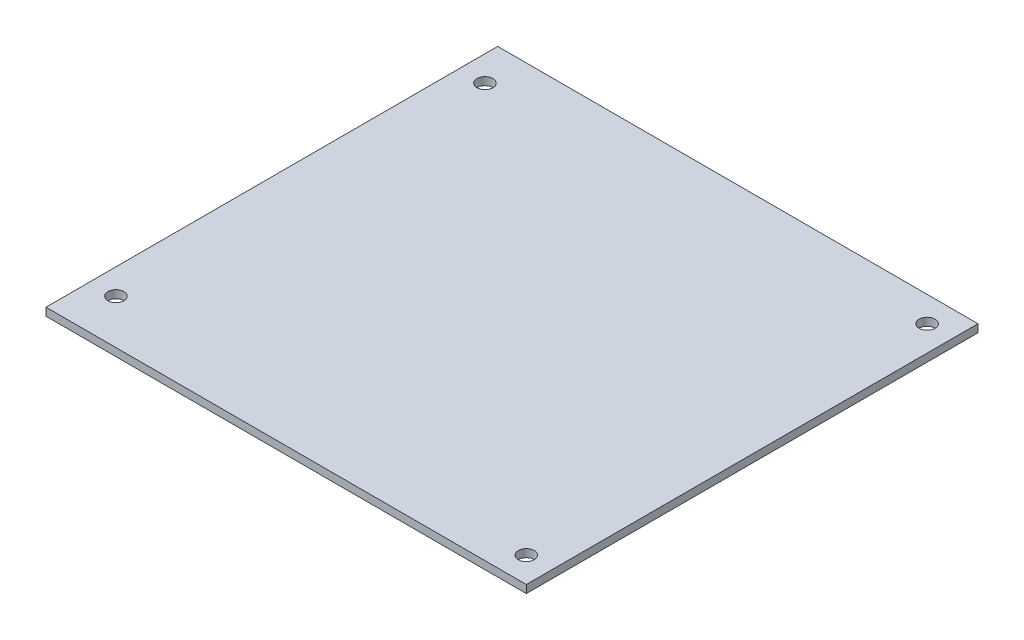
ISO-10303-21;
HEADER;
FILE_DESCRIPTION(('STEP AP214'),'2;1');
FILE_NAME('part.step','',(''),(''),'','','');
FILE_SCHEMA(('AUTOMOTIVE_DESIGN { 1 0 10303 214 1 1 1 1 }'));
ENDSEC;
DATA;
#1=APPLICATION_CONTEXT('core data for automotive mechanical design processes');
#2=APPLICATION_PROTOCOL_DEFINITION('international standard','automotive_design',2000,#1);
#3=PRODUCT_CONTEXT('',#1,'mechanical');
#4=PRODUCT('Part','Part','',(#3));
#5=PRODUCT_RELATED_PRODUCT_CATEGORY('part','',(#4));
#6=PRODUCT_DEFINITION_FORMATION('','',#4);
#7=PRODUCT_DEFINITION_CONTEXT('part definition',#1,'design');
#8=PRODUCT_DEFINITION('design','',#6,#7);
#9=PRODUCT_DEFINITION_SHAPE('','',#8);
#10=(LENGTH_UNIT() NAMED_UNIT(*) SI_UNIT(.MILLI.,.METRE.));
#11=(NAMED_UNIT(*) PLANE_ANGLE_UNIT() SI_UNIT($,.RADIAN.));
#12=(NAMED_UNIT(*) SI_UNIT($,.STERADIAN.) SOLID_ANGLE_UNIT());
#13=UNCERTAINTY_MEASURE_WITH_UNIT(LENGTH_MEASURE(1.E-05),#10,'distance_accuracy_value','');
#14=(GEOMETRIC_REPRESENTATION_CONTEXT(3) GLOBAL_UNCERTAINTY_ASSIGNED_CONTEXT((#13)) GLOBAL_UNIT_ASSIGNED_CONTEXT((#10,
#11,#12)) REPRESENTATION_CONTEXT('',''));
#15=CARTESIAN_POINT('',(0.,0.,0.));
#16=DIRECTION('',(0.,0.,1.));
#17=DIRECTION('',(1.,0.,0.));
#18=AXIS2_PLACEMENT_3D('',#15,#16,#17);
#19=CARTESIAN_POINT('',(-47.945,1.57,45.085));
#20=DIRECTION('',(1.,0.,0.));
#21=DIRECTION('',(0.,0.,-1.));
#22=AXIS2_PLACEMENT_3D('',#19,#20,#21);
#23=PLANE('',#22);
#24=DIRECTION('',(0.,0.,1.));
#25=VECTOR('',#24,1.);
#26=CARTESIAN_POINT('',(-47.945,0.,45.085));
#27=LINE('',#26,#25);
#28=CARTESIAN_POINT('',(-47.945,0.,-45.085));
#29=VERTEX_POINT('',#28);
#30=CARTESIAN_POINT('',(-47.945,0.,45.085));
#31=VERTEX_POINT('',#30);
#32=EDGE_CURVE('E95',#29,#31,#27,.T.);
#33=ORIENTED_EDGE('',*,*,#32,.T.);
#34=DIRECTION('',(0.,-1.,0.));
#35=VECTOR('',#34,1.);
#36=CARTESIAN_POINT('',(-47.945,1.57,45.085));
#37=LINE('',#36,#35);
#38=CARTESIAN_POINT('',(-47.945,1.57,45.085));
#39=VERTEX_POINT('',#38);
#40=EDGE_CURVE('E11',#39,#31,#37,.T.);
#41=ORIENTED_EDGE('',*,*,#40,.F.);
#42=DIRECTION('',(0.,0.,1.));
#43=VECTOR('',#42,1.);
#44=CARTESIAN_POINT('',(-47.945,1.57,45.085));
#45=LINE('',#44,#43);
#46=CARTESIAN_POINT('',(-47.945,1.57,-45.085));
#47=VERTEX_POINT('',#46);
#48=EDGE_CURVE('E83',#47,#39,#45,.T.);
#49=ORIENTED_EDGE('',*,*,#48,.F.);
#50=DIRECTION('',(0.,-1.,0.));
#51=VECTOR('',#50,1.);
#52=CARTESIAN_POINT('',(-47.945,1.57,-45.085));
#53=LINE('',#52,#51);
#54=EDGE_CURVE('E91',#47,#29,#53,.T.);
#55=ORIENTED_EDGE('',*,*,#54,.T.);
#56=EDGE_LOOP('',(#33,#41,#49,#55));
#57=FACE_BOUND('',#56,.T.);
#58=ADVANCED_FACE('F32',(#57),#23,.F.);
#59=CARTESIAN_POINT('',(47.945,1.57,45.085));
#60=DIRECTION('',(0.,0.,-1.));
#61=DIRECTION('',(-1.,0.,0.));
#62=AXIS2_PLACEMENT_3D('',#59,#60,#61);
#63=PLANE('',#62);
#64=DIRECTION('',(1.,0.,0.));
#65=VECTOR('',#64,1.);
#66=CARTESIAN_POINT('',(47.945,0.,45.085));
#67=LINE('',#66,#65);
#68=CARTESIAN_POINT('',(47.945,0.,45.085));
#69=VERTEX_POINT('',#68);
#70=EDGE_CURVE('E87',#31,#69,#67,.T.);
#71=ORIENTED_EDGE('',*,*,#70,.T.);
#72=DIRECTION('',(0.,-1.,0.));
#73=VECTOR('',#72,1.);
#74=CARTESIAN_POINT('',(47.945,1.57,45.085));
#75=LINE('',#74,#73);
#76=CARTESIAN_POINT('',(47.945,1.57,45.085));
#77=VERTEX_POINT('',#76);
#78=EDGE_CURVE('E40',#77,#69,#75,.T.);
#79=ORIENTED_EDGE('',*,*,#78,.F.);
#80=DIRECTION('',(1.,0.,0.));
#81=VECTOR('',#80,1.);
#82=CARTESIAN_POINT('',(47.945,1.57,45.085));
#83=LINE('',#82,#81);
#84=EDGE_CURVE('E78',#39,#77,#83,.T.);
#85=ORIENTED_EDGE('',*,*,#84,.F.);
#86=ORIENTED_EDGE('',*,*,#40,.T.);
#87=EDGE_LOOP('',(#71,#79,#85,#86));
#88=FACE_BOUND('',#87,.T.);
#89=ADVANCED_FACE('F86',(#88),#63,.F.);
#90=CARTESIAN_POINT('',(47.945,1.57,45.085));
#91=DIRECTION('',(-1.,0.,0.));
#92=DIRECTION('',(0.,0.,1.));
#93=AXIS2_PLACEMENT_3D('',#90,#91,#92);
#94=PLANE('',#93);
#95=DIRECTION('',(0.,0.,-1.));
#96=VECTOR('',#95,1.);
#97=CARTESIAN_POINT('',(47.945,0.,45.085));
#98=LINE('',#97,#96);
#99=CARTESIAN_POINT('',(47.945,0.,-45.085));
#100=VERTEX_POINT('',#99);
#101=EDGE_CURVE('E65',#69,#100,#98,.T.);
#102=ORIENTED_EDGE('',*,*,#101,.T.);
#103=DIRECTION('',(0.,-1.,0.));
#104=VECTOR('',#103,1.);
#105=CARTESIAN_POINT('',(47.945,1.57,-45.085));
#106=LINE('',#105,#104);
#107=CARTESIAN_POINT('',(47.945,1.57,-45.085));
#108=VERTEX_POINT('',#107);
#109=EDGE_CURVE('E88',#108,#100,#106,.T.);
#110=ORIENTED_EDGE('',*,*,#109,.F.);
#111=DIRECTION('',(0.,0.,-1.));
#112=VECTOR('',#111,1.);
#113=CARTESIAN_POINT('',(47.945,1.57,45.085));
#114=LINE('',#113,#112);
#115=EDGE_CURVE('E81',#77,#108,#114,.T.);
#116=ORIENTED_EDGE('',*,*,#115,.F.);
#117=ORIENTED_EDGE('',*,*,#78,.T.);
#118=EDGE_LOOP('',(#102,#110,#116,#117));
#119=FACE_BOUND('',#118,.T.);
#120=ADVANCED_FACE('F89',(#119),#94,.F.);
#121=CARTESIAN_POINT('',(47.945,1.57,-45.085));
#122=DIRECTION('',(0.,0.,1.));
#123=DIRECTION('',(1.,0.,0.));
#124=AXIS2_PLACEMENT_3D('',#121,#122,#123);
#125=PLANE('',#124);
#126=DIRECTION('',(-1.,0.,0.));
#127=VECTOR('',#126,1.);
#128=CARTESIAN_POINT('',(47.945,0.,-45.085));
#129=LINE('',#128,#127);
#130=EDGE_CURVE('E71',#100,#29,#129,.T.);
#131=ORIENTED_EDGE('',*,*,#130,.T.);
#132=ORIENTED_EDGE('',*,*,#54,.F.);
#133=DIRECTION('',(-1.,0.,0.));
#134=VECTOR('',#133,1.);
#135=CARTESIAN_POINT('',(47.945,1.57,-45.085));
#136=LINE('',#135,#134);
#137=EDGE_CURVE('E48',#108,#47,#136,.T.);
#138=ORIENTED_EDGE('',*,*,#137,.F.);
#139=ORIENTED_EDGE('',*,*,#109,.T.);
#140=EDGE_LOOP('',(#131,#132,#138,#139));
#141=FACE_BOUND('',#140,.T.);
#142=ADVANCED_FACE('F103',(#141),#125,.F.);
#143=CARTESIAN_POINT('',(0.,1.57,0.));
#144=DIRECTION('',(0.,1.,0.));
#145=DIRECTION('',(0.,0.,1.));
#146=AXIS2_PLACEMENT_3D('',#143,#144,#145);
#147=PLANE('',#146);
#148=CARTESIAN_POINT('',(42.865,1.57,-40.005));
#149=DIRECTION('',(0.,1.,0.));
#150=DIRECTION('',(0.,0.,1.));
#151=AXIS2_PLACEMENT_3D('',#148,#149,#150);
#152=CIRCLE('',#151,1.59);
#153=CARTESIAN_POINT('',(42.865,1.57,-38.415));
#154=VERTEX_POINT('',#153);
#155=EDGE_CURVE('E127',#154,#154,#152,.T.);
#156=ORIENTED_EDGE('',*,*,#155,.F.);
#157=EDGE_LOOP('',(#156));
#158=FACE_BOUND('',#157,.T.);
#159=CARTESIAN_POINT('',(-42.865,1.57,-37.465));
#160=DIRECTION('',(0.,1.,0.));
#161=DIRECTION('',(0.,0.,1.));
#162=AXIS2_PLACEMENT_3D('',#159,#160,#161);
#163=CIRCLE('',#162,1.59);
#164=CARTESIAN_POINT('',(-42.865,1.57,-35.875));
#165=VERTEX_POINT('',#164);
#166=EDGE_CURVE('E121',#165,#165,#163,.T.);
#167=ORIENTED_EDGE('',*,*,#166,.F.);
#168=EDGE_LOOP('',(#167));
#169=FACE_BOUND('',#168,.T.);
#170=CARTESIAN_POINT('',(-42.865,1.57,36.195));
#171=DIRECTION('',(0.,1.,0.));
#172=DIRECTION('',(0.,0.,1.));
#173=AXIS2_PLACEMENT_3D('',#170,#171,#172);
#174=CIRCLE('',#173,1.59);
#175=CARTESIAN_POINT('',(-42.865,1.57,37.785));
#176=VERTEX_POINT('',#175);
#177=EDGE_CURVE('E115',#176,#176,#174,.T.);
#178=ORIENTED_EDGE('',*,*,#177,.F.);
#179=EDGE_LOOP('',(#178));
#180=FACE_BOUND('',#179,.T.);
#181=CARTESIAN_POINT('',(42.865,1.57,40.005));
#182=DIRECTION('',(0.,1.,0.));
#183=DIRECTION('',(0.,0.,1.));
#184=AXIS2_PLACEMENT_3D('',#181,#182,#183);
#185=CIRCLE('',#184,1.59);
#186=CARTESIAN_POINT('',(42.865,1.57,41.595));
#187=VERTEX_POINT('',#186);
#188=EDGE_CURVE('E109',#187,#187,#185,.T.);
#189=ORIENTED_EDGE('',*,*,#188,.F.);
#190=EDGE_LOOP('',(#189));
#191=FACE_BOUND('',#190,.T.);
#192=ORIENTED_EDGE('',*,*,#48,.T.);
#193=ORIENTED_EDGE('',*,*,#84,.T.);
#194=ORIENTED_EDGE('',*,*,#115,.T.);
#195=ORIENTED_EDGE('',*,*,#137,.T.);
#196=EDGE_LOOP('',(#192,#193,#194,#195));
#197=FACE_BOUND('',#196,.T.);
#198=ADVANCED_FACE('F79',(#158,#169,#180,#191,#197),#147,.T.);
#199=CARTESIAN_POINT('',(0.,0.,0.));
#200=DIRECTION('',(0.,1.,0.));
#201=DIRECTION('',(0.,0.,1.));
#202=AXIS2_PLACEMENT_3D('',#199,#200,#201);
#203=PLANE('',#202);
#204=CARTESIAN_POINT('',(42.865,0.,-40.005));
#205=DIRECTION('',(0.,1.,0.));
#206=DIRECTION('',(0.,0.,1.));
#207=AXIS2_PLACEMENT_3D('',#204,#205,#206);
#208=CIRCLE('',#207,1.59);
#209=CARTESIAN_POINT('',(42.865,0.,-38.415));
#210=VERTEX_POINT('',#209);
#211=EDGE_CURVE('E124',#210,#210,#208,.T.);
#212=ORIENTED_EDGE('',*,*,#211,.T.);
#213=EDGE_LOOP('',(#212));
#214=FACE_BOUND('',#213,.T.);
#215=CARTESIAN_POINT('',(-42.865,0.,-37.465));
#216=DIRECTION('',(0.,1.,0.));
#217=DIRECTION('',(0.,0.,1.));
#218=AXIS2_PLACEMENT_3D('',#215,#216,#217);
#219=CIRCLE('',#218,1.59);
#220=CARTESIAN_POINT('',(-42.865,0.,-35.875));
#221=VERTEX_POINT('',#220);
#222=EDGE_CURVE('E118',#221,#221,#219,.T.);
#223=ORIENTED_EDGE('',*,*,#222,.T.);
#224=EDGE_LOOP('',(#223));
#225=FACE_BOUND('',#224,.T.);
#226=CARTESIAN_POINT('',(-42.865,0.,36.195));
#227=DIRECTION('',(0.,1.,0.));
#228=DIRECTION('',(0.,0.,1.));
#229=AXIS2_PLACEMENT_3D('',#226,#227,#228);
#230=CIRCLE('',#229,1.59);
#231=CARTESIAN_POINT('',(-42.865,0.,37.785));
#232=VERTEX_POINT('',#231);
#233=EDGE_CURVE('E112',#232,#232,#230,.T.);
#234=ORIENTED_EDGE('',*,*,#233,.T.);
#235=EDGE_LOOP('',(#234));
#236=FACE_BOUND('',#235,.T.);
#237=CARTESIAN_POINT('',(42.865,0.,40.005));
#238=DIRECTION('',(0.,1.,0.));
#239=DIRECTION('',(0.,0.,1.));
#240=AXIS2_PLACEMENT_3D('',#237,#238,#239);
#241=CIRCLE('',#240,1.59);
#242=CARTESIAN_POINT('',(42.865,0.,41.595));
#243=VERTEX_POINT('',#242);
#244=EDGE_CURVE('E98',#243,#243,#241,.T.);
#245=ORIENTED_EDGE('',*,*,#244,.T.);
#246=EDGE_LOOP('',(#245));
#247=FACE_BOUND('',#246,.T.);
#248=ORIENTED_EDGE('',*,*,#32,.F.);
#249=ORIENTED_EDGE('',*,*,#130,.F.);
#250=ORIENTED_EDGE('',*,*,#101,.F.);
#251=ORIENTED_EDGE('',*,*,#70,.F.);
#252=EDGE_LOOP('',(#248,#249,#250,#251));
#253=FACE_BOUND('',#252,.T.);
#254=ADVANCED_FACE('F106',(#214,#225,#236,#247,#253),#203,.F.);
#255=CARTESIAN_POINT('',(42.865,0.,40.005));
#256=DIRECTION('',(0.,1.,0.));
#257=DIRECTION('',(0.,0.,1.));
#258=AXIS2_PLACEMENT_3D('',#255,#256,#257);
#259=CYLINDRICAL_SURFACE('',#258,1.59);
#260=ORIENTED_EDGE('',*,*,#244,.F.);
#261=EDGE_LOOP('',(#260));
#262=FACE_BOUND('',#261,.T.);
#263=ORIENTED_EDGE('',*,*,#188,.T.);
#264=EDGE_LOOP('',(#263));
#265=FACE_BOUND('',#264,.T.);
#266=ADVANCED_FACE('F151',(#262,#265),#259,.F.);
#267=CARTESIAN_POINT('',(-42.865,0.,36.195));
#268=DIRECTION('',(0.,1.,0.));
#269=DIRECTION('',(0.,0.,1.));
#270=AXIS2_PLACEMENT_3D('',#267,#268,#269);
#271=CYLINDRICAL_SURFACE('',#270,1.59);
#272=ORIENTED_EDGE('',*,*,#233,.F.);
#273=EDGE_LOOP('',(#272));
#274=FACE_BOUND('',#273,.T.);
#275=ORIENTED_EDGE('',*,*,#177,.T.);
#276=EDGE_LOOP('',(#275));
#277=FACE_BOUND('',#276,.T.);
#278=ADVANCED_FACE('F153',(#274,#277),#271,.F.);
#279=CARTESIAN_POINT('',(-42.865,0.,-37.465));
#280=DIRECTION('',(0.,1.,0.));
#281=DIRECTION('',(0.,0.,1.));
#282=AXIS2_PLACEMENT_3D('',#279,#280,#281);
#283=CYLINDRICAL_SURFACE('',#282,1.59);
#284=ORIENTED_EDGE('',*,*,#222,.F.);
#285=EDGE_LOOP('',(#284));
#286=FACE_BOUND('',#285,.T.);
#287=ORIENTED_EDGE('',*,*,#166,.T.);
#288=EDGE_LOOP('',(#287));
#289=FACE_BOUND('',#288,.T.);
#290=ADVANCED_FACE('F138',(#286,#289),#283,.F.);
#291=CARTESIAN_POINT('',(42.865,0.,-40.005));
#292=DIRECTION('',(0.,1.,0.));
#293=DIRECTION('',(0.,0.,1.));
#294=AXIS2_PLACEMENT_3D('',#291,#292,#293);
#295=CYLINDRICAL_SURFACE('',#294,1.59);
#296=ORIENTED_EDGE('',*,*,#211,.F.);
#297=EDGE_LOOP('',(#296));
#298=FACE_BOUND('',#297,.T.);
#299=ORIENTED_EDGE('',*,*,#155,.T.);
#300=EDGE_LOOP('',(#299));
#301=FACE_BOUND('',#300,.T.);
#302=ADVANCED_FACE('F135',(#298,#301),#295,.F.);
#303=CLOSED_SHELL('',(#58,#89,#120,#142,#198,#254,#266,#278,#290,#302));
#304=MANIFOLD_SOLID_BREP('B2',#303);
#305=ADVANCED_BREP_SHAPE_REPRESENTATION('',(#18,#304),#14);
#306=SHAPE_DEFINITION_REPRESENTATION(#9,#305);
ENDSEC;
END-ISO-10303-21;
